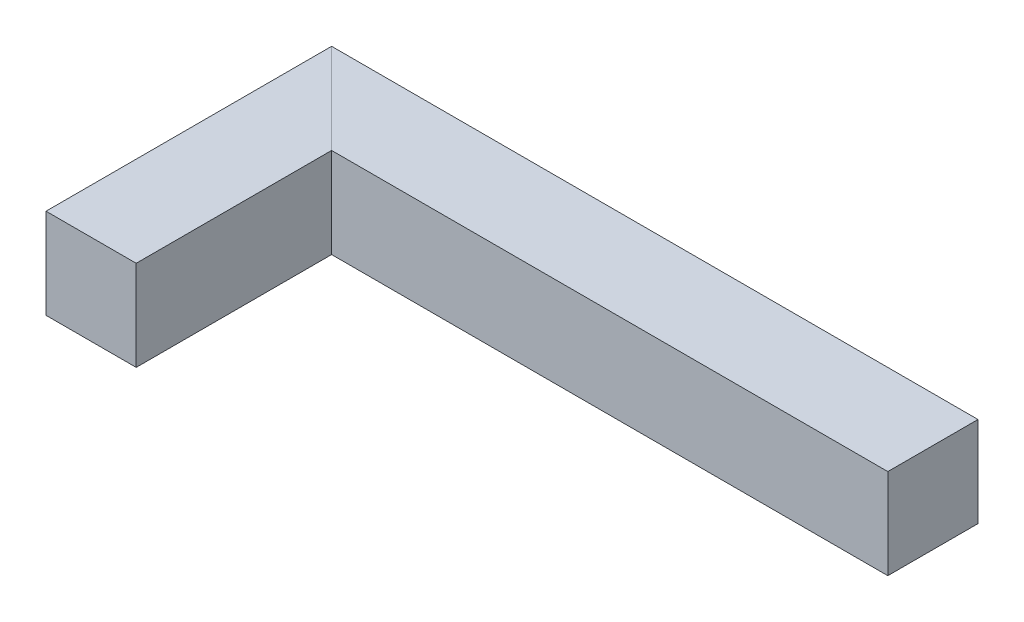
ISO-10303-21;
HEADER;
FILE_DESCRIPTION(('STEP AP214'),'2;1');
FILE_NAME('part.step','',(''),(''),'','','');
FILE_SCHEMA(('AUTOMOTIVE_DESIGN { 1 0 10303 214 1 1 1 1 }'));
ENDSEC;
DATA;
#1=APPLICATION_CONTEXT('core data for automotive mechanical design processes');
#2=APPLICATION_PROTOCOL_DEFINITION('international standard','automotive_design',2000,#1);
#3=PRODUCT_CONTEXT('',#1,'mechanical');
#4=PRODUCT('Part','Part','',(#3));
#5=PRODUCT_RELATED_PRODUCT_CATEGORY('part','',(#4));
#6=PRODUCT_DEFINITION_FORMATION('','',#4);
#7=PRODUCT_DEFINITION_CONTEXT('part definition',#1,'design');
#8=PRODUCT_DEFINITION('design','',#6,#7);
#9=PRODUCT_DEFINITION_SHAPE('','',#8);
#10=(LENGTH_UNIT() NAMED_UNIT(*) SI_UNIT(.MILLI.,.METRE.));
#11=(NAMED_UNIT(*) PLANE_ANGLE_UNIT() SI_UNIT($,.RADIAN.));
#12=(NAMED_UNIT(*) SI_UNIT($,.STERADIAN.) SOLID_ANGLE_UNIT());
#13=UNCERTAINTY_MEASURE_WITH_UNIT(LENGTH_MEASURE(1.E-05),#10,'distance_accuracy_value','');
#14=(GEOMETRIC_REPRESENTATION_CONTEXT(3) GLOBAL_UNCERTAINTY_ASSIGNED_CONTEXT((#13)) GLOBAL_UNIT_ASSIGNED_CONTEXT((#10,
#11,#12)) REPRESENTATION_CONTEXT('',''));
#15=CARTESIAN_POINT('',(0.,0.,0.));
#16=DIRECTION('',(0.,0.,1.));
#17=DIRECTION('',(1.,0.,0.));
#18=AXIS2_PLACEMENT_3D('',#15,#16,#17);
#19=CARTESIAN_POINT('',(200.,0.,-80.));
#20=DIRECTION('',(-1.,0.,0.));
#21=DIRECTION('',(0.,0.,1.));
#22=AXIS2_PLACEMENT_3D('',#19,#20,#21);
#23=PLANE('',#22);
#24=DIRECTION('',(0.,-1.,0.));
#25=VECTOR('',#24,1.);
#26=CARTESIAN_POINT('',(200.,-15.,-95.));
#27=LINE('',#26,#25);
#28=CARTESIAN_POINT('',(200.,15.,-95.));
#29=VERTEX_POINT('',#28);
#30=CARTESIAN_POINT('',(200.,-15.,-95.));
#31=VERTEX_POINT('',#30);
#32=EDGE_CURVE('E133',#29,#31,#27,.T.);
#33=ORIENTED_EDGE('',*,*,#32,.F.);
#34=DIRECTION('',(0.,0.,-1.));
#35=VECTOR('',#34,1.);
#36=CARTESIAN_POINT('',(200.,15.,-65.));
#37=LINE('',#36,#35);
#38=CARTESIAN_POINT('',(200.,15.,-65.));
#39=VERTEX_POINT('',#38);
#40=EDGE_CURVE('E135',#39,#29,#37,.T.);
#41=ORIENTED_EDGE('',*,*,#40,.F.);
#42=DIRECTION('',(0.,1.,0.));
#43=VECTOR('',#42,1.);
#44=CARTESIAN_POINT('',(200.,-15.,-65.));
#45=LINE('',#44,#43);
#46=CARTESIAN_POINT('',(200.,-15.,-65.));
#47=VERTEX_POINT('',#46);
#48=EDGE_CURVE('E67',#47,#39,#45,.T.);
#49=ORIENTED_EDGE('',*,*,#48,.F.);
#50=DIRECTION('',(0.,0.,1.));
#51=VECTOR('',#50,1.);
#52=CARTESIAN_POINT('',(200.,-15.,-65.));
#53=LINE('',#52,#51);
#54=EDGE_CURVE('E75',#31,#47,#53,.T.);
#55=ORIENTED_EDGE('',*,*,#54,.F.);
#56=EDGE_LOOP('',(#33,#41,#49,#55));
#57=FACE_BOUND('',#56,.T.);
#58=ADVANCED_FACE('F33',(#57),#23,.F.);
#59=CARTESIAN_POINT('',(0.,0.,0.));
#60=DIRECTION('',(0.,0.,1.));
#61=DIRECTION('',(1.,0.,0.));
#62=AXIS2_PLACEMENT_3D('',#59,#60,#61);
#63=PLANE('',#62);
#64=DIRECTION('',(0.,-1.,0.));
#65=VECTOR('',#64,1.);
#66=CARTESIAN_POINT('',(-15.,-15.,0.));
#67=LINE('',#66,#65);
#68=CARTESIAN_POINT('',(-15.,15.,0.));
#69=VERTEX_POINT('',#68);
#70=CARTESIAN_POINT('',(-15.,-15.,0.));
#71=VERTEX_POINT('',#70);
#72=EDGE_CURVE('E120',#69,#71,#67,.T.);
#73=ORIENTED_EDGE('',*,*,#72,.T.);
#74=DIRECTION('',(1.,0.,0.));
#75=VECTOR('',#74,1.);
#76=CARTESIAN_POINT('',(15.,-15.,0.));
#77=LINE('',#76,#75);
#78=CARTESIAN_POINT('',(15.,-15.,0.));
#79=VERTEX_POINT('',#78);
#80=EDGE_CURVE('E116',#71,#79,#77,.T.);
#81=ORIENTED_EDGE('',*,*,#80,.T.);
#82=DIRECTION('',(0.,1.,0.));
#83=VECTOR('',#82,1.);
#84=CARTESIAN_POINT('',(15.,-15.,0.));
#85=LINE('',#84,#83);
#86=CARTESIAN_POINT('',(15.,15.,0.));
#87=VERTEX_POINT('',#86);
#88=EDGE_CURVE('E83',#79,#87,#85,.T.);
#89=ORIENTED_EDGE('',*,*,#88,.T.);
#90=DIRECTION('',(-1.,0.,0.));
#91=VECTOR('',#90,1.);
#92=CARTESIAN_POINT('',(15.,15.,0.));
#93=LINE('',#92,#91);
#94=EDGE_CURVE('E124',#87,#69,#93,.T.);
#95=ORIENTED_EDGE('',*,*,#94,.T.);
#96=EDGE_LOOP('',(#73,#81,#89,#95));
#97=FACE_BOUND('',#96,.T.);
#98=ADVANCED_FACE('F148',(#97),#63,.T.);
#99=CARTESIAN_POINT('',(-16.6,-15.,-65.));
#100=DIRECTION('',(0.,0.,-1.));
#101=DIRECTION('',(-1.,0.,0.));
#102=AXIS2_PLACEMENT_3D('',#99,#100,#101);
#103=PLANE('',#102);
#104=DIRECTION('',(0.,-1.,0.));
#105=VECTOR('',#104,1.);
#106=CARTESIAN_POINT('',(15.,-15.,-65.));
#107=LINE('',#106,#105);
#108=CARTESIAN_POINT('',(15.,15.,-65.));
#109=VERTEX_POINT('',#108);
#110=CARTESIAN_POINT('',(15.,-15.,-65.));
#111=VERTEX_POINT('',#110);
#112=EDGE_CURVE('E106',#109,#111,#107,.T.);
#113=ORIENTED_EDGE('',*,*,#112,.T.);
#114=DIRECTION('',(1.,0.,0.));
#115=VECTOR('',#114,1.);
#116=CARTESIAN_POINT('',(-16.6,-15.,-65.));
#117=LINE('',#116,#115);
#118=EDGE_CURVE('E36',#111,#47,#117,.T.);
#119=ORIENTED_EDGE('',*,*,#118,.T.);
#120=ORIENTED_EDGE('',*,*,#48,.T.);
#121=DIRECTION('',(1.,0.,0.));
#122=VECTOR('',#121,1.);
#123=CARTESIAN_POINT('',(-16.6,15.,-65.));
#124=LINE('',#123,#122);
#125=EDGE_CURVE('E110',#109,#39,#124,.T.);
#126=ORIENTED_EDGE('',*,*,#125,.F.);
#127=EDGE_LOOP('',(#113,#119,#120,#126));
#128=FACE_BOUND('',#127,.T.);
#129=ADVANCED_FACE('F111',(#128),#103,.F.);
#130=CARTESIAN_POINT('',(-16.6,15.,-65.));
#131=DIRECTION('',(0.,-1.,0.));
#132=DIRECTION('',(0.,0.,-1.));
#133=AXIS2_PLACEMENT_3D('',#130,#131,#132);
#134=PLANE('',#133);
#135=DIRECTION('',(0.707106781186548,0.,0.707106781186548));
#136=VECTOR('',#135,1.);
#137=CARTESIAN_POINT('',(47.5,15.,-32.5));
#138=LINE('',#137,#136);
#139=CARTESIAN_POINT('',(-15.,15.,-95.));
#140=VERTEX_POINT('',#139);
#141=EDGE_CURVE('E11',#140,#109,#138,.T.);
#142=ORIENTED_EDGE('',*,*,#141,.T.);
#143=ORIENTED_EDGE('',*,*,#125,.T.);
#144=ORIENTED_EDGE('',*,*,#40,.T.);
#145=DIRECTION('',(1.,0.,0.));
#146=VECTOR('',#145,1.);
#147=CARTESIAN_POINT('',(-16.6,15.,-95.));
#148=LINE('',#147,#146);
#149=EDGE_CURVE('E140',#140,#29,#148,.T.);
#150=ORIENTED_EDGE('',*,*,#149,.F.);
#151=EDGE_LOOP('',(#142,#143,#144,#150));
#152=FACE_BOUND('',#151,.T.);
#153=ADVANCED_FACE('F143',(#152),#134,.F.);
#154=CARTESIAN_POINT('',(-16.6,-15.,-95.));
#155=DIRECTION('',(0.,0.,1.));
#156=DIRECTION('',(1.,0.,0.));
#157=AXIS2_PLACEMENT_3D('',#154,#155,#156);
#158=PLANE('',#157);
#159=DIRECTION('',(0.,1.,0.));
#160=VECTOR('',#159,1.);
#161=CARTESIAN_POINT('',(-15.,-15.,-95.));
#162=LINE('',#161,#160);
#163=CARTESIAN_POINT('',(-15.,-15.,-95.));
#164=VERTEX_POINT('',#163);
#165=EDGE_CURVE('E42',#164,#140,#162,.T.);
#166=ORIENTED_EDGE('',*,*,#165,.T.);
#167=ORIENTED_EDGE('',*,*,#149,.T.);
#168=ORIENTED_EDGE('',*,*,#32,.T.);
#169=DIRECTION('',(1.,0.,0.));
#170=VECTOR('',#169,1.);
#171=CARTESIAN_POINT('',(-16.6,-15.,-95.));
#172=LINE('',#171,#170);
#173=EDGE_CURVE('E138',#164,#31,#172,.T.);
#174=ORIENTED_EDGE('',*,*,#173,.F.);
#175=EDGE_LOOP('',(#166,#167,#168,#174));
#176=FACE_BOUND('',#175,.T.);
#177=ADVANCED_FACE('F152',(#176),#158,.F.);
#178=CARTESIAN_POINT('',(-16.6,-15.,-65.));
#179=DIRECTION('',(0.,1.,0.));
#180=DIRECTION('',(0.,0.,1.));
#181=AXIS2_PLACEMENT_3D('',#178,#179,#180);
#182=PLANE('',#181);
#183=DIRECTION('',(-0.707106781186548,0.,-0.707106781186548));
#184=VECTOR('',#183,1.);
#185=CARTESIAN_POINT('',(47.5,-15.,-32.5));
#186=LINE('',#185,#184);
#187=EDGE_CURVE('E101',#111,#164,#186,.T.);
#188=ORIENTED_EDGE('',*,*,#187,.T.);
#189=ORIENTED_EDGE('',*,*,#173,.T.);
#190=ORIENTED_EDGE('',*,*,#54,.T.);
#191=ORIENTED_EDGE('',*,*,#118,.F.);
#192=EDGE_LOOP('',(#188,#189,#190,#191));
#193=FACE_BOUND('',#192,.T.);
#194=ADVANCED_FACE('F109',(#193),#182,.F.);
#195=CARTESIAN_POINT('',(15.,-15.,0.));
#196=DIRECTION('',(0.,1.,0.));
#197=DIRECTION('',(-1.,0.,0.));
#198=AXIS2_PLACEMENT_3D('',#195,#196,#197);
#199=PLANE('',#198);
#200=DIRECTION('',(0.,0.,-1.));
#201=VECTOR('',#200,1.);
#202=CARTESIAN_POINT('',(15.,-15.,0.));
#203=LINE('',#202,#201);
#204=EDGE_CURVE('E103',#79,#111,#203,.T.);
#205=ORIENTED_EDGE('',*,*,#204,.F.);
#206=ORIENTED_EDGE('',*,*,#80,.F.);
#207=DIRECTION('',(0.,0.,-1.));
#208=VECTOR('',#207,1.);
#209=CARTESIAN_POINT('',(-15.,-15.,0.));
#210=LINE('',#209,#208);
#211=EDGE_CURVE('E105',#71,#164,#210,.T.);
#212=ORIENTED_EDGE('',*,*,#211,.T.);
#213=ORIENTED_EDGE('',*,*,#187,.F.);
#214=EDGE_LOOP('',(#205,#206,#212,#213));
#215=FACE_BOUND('',#214,.T.);
#216=ADVANCED_FACE('F102',(#215),#199,.F.);
#217=CARTESIAN_POINT('',(-15.,-15.,0.));
#218=DIRECTION('',(1.,0.,0.));
#219=DIRECTION('',(0.,0.,-1.));
#220=AXIS2_PLACEMENT_3D('',#217,#218,#219);
#221=PLANE('',#220);
#222=ORIENTED_EDGE('',*,*,#211,.F.);
#223=ORIENTED_EDGE('',*,*,#72,.F.);
#224=DIRECTION('',(0.,0.,-1.));
#225=VECTOR('',#224,1.);
#226=CARTESIAN_POINT('',(-15.,15.,0.));
#227=LINE('',#226,#225);
#228=EDGE_CURVE('E118',#69,#140,#227,.T.);
#229=ORIENTED_EDGE('',*,*,#228,.T.);
#230=ORIENTED_EDGE('',*,*,#165,.F.);
#231=EDGE_LOOP('',(#222,#223,#229,#230));
#232=FACE_BOUND('',#231,.T.);
#233=ADVANCED_FACE('F154',(#232),#221,.F.);
#234=CARTESIAN_POINT('',(15.,15.,0.));
#235=DIRECTION('',(0.,-1.,0.));
#236=DIRECTION('',(1.,0.,0.));
#237=AXIS2_PLACEMENT_3D('',#234,#235,#236);
#238=PLANE('',#237);
#239=ORIENTED_EDGE('',*,*,#228,.F.);
#240=ORIENTED_EDGE('',*,*,#94,.F.);
#241=DIRECTION('',(0.,0.,-1.));
#242=VECTOR('',#241,1.);
#243=CARTESIAN_POINT('',(15.,15.,0.));
#244=LINE('',#243,#242);
#245=EDGE_CURVE('E115',#87,#109,#244,.T.);
#246=ORIENTED_EDGE('',*,*,#245,.T.);
#247=ORIENTED_EDGE('',*,*,#141,.F.);
#248=EDGE_LOOP('',(#239,#240,#246,#247));
#249=FACE_BOUND('',#248,.T.);
#250=ADVANCED_FACE('F146',(#249),#238,.F.);
#251=CARTESIAN_POINT('',(15.,-15.,0.));
#252=DIRECTION('',(-1.,0.,0.));
#253=DIRECTION('',(0.,0.,1.));
#254=AXIS2_PLACEMENT_3D('',#251,#252,#253);
#255=PLANE('',#254);
#256=ORIENTED_EDGE('',*,*,#245,.F.);
#257=ORIENTED_EDGE('',*,*,#88,.F.);
#258=ORIENTED_EDGE('',*,*,#204,.T.);
#259=ORIENTED_EDGE('',*,*,#112,.F.);
#260=EDGE_LOOP('',(#256,#257,#258,#259));
#261=FACE_BOUND('',#260,.T.);
#262=ADVANCED_FACE('F114',(#261),#255,.F.);
#263=CLOSED_SHELL('',(#58,#98,#129,#153,#177,#194,#216,#233,#250,#262));
#264=MANIFOLD_SOLID_BREP('B2',#263);
#265=ADVANCED_BREP_SHAPE_REPRESENTATION('',(#18,#264),#14);
#266=SHAPE_DEFINITION_REPRESENTATION(#9,#265);
ENDSEC;
END-ISO-10303-21;
